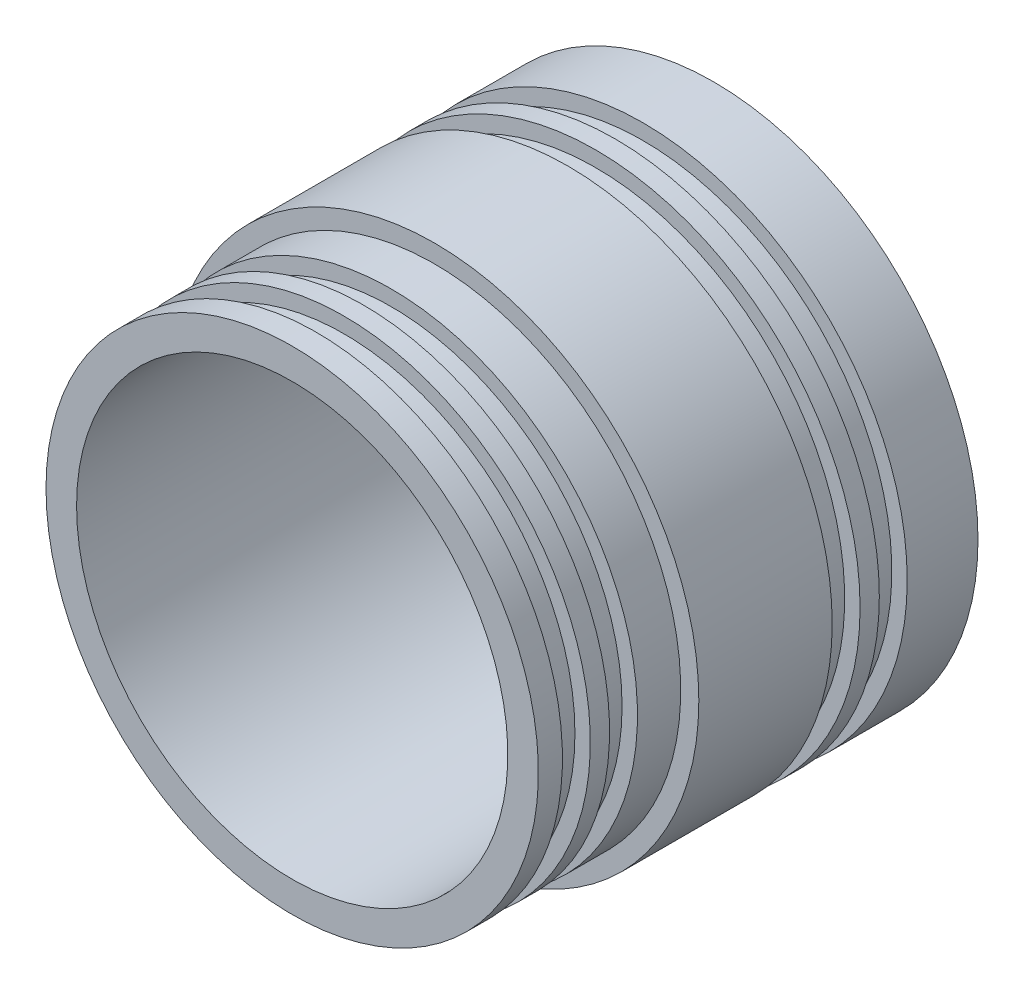
ISO-10303-21;
HEADER;
FILE_DESCRIPTION(('STEP AP214'),'2;1');
FILE_NAME('part.step','',(''),(''),'','','');
FILE_SCHEMA(('AUTOMOTIVE_DESIGN { 1 0 10303 214 1 1 1 1 }'));
ENDSEC;
DATA;
#1=APPLICATION_CONTEXT('core data for automotive mechanical design processes');
#2=APPLICATION_PROTOCOL_DEFINITION('international standard','automotive_design',2000,#1);
#3=PRODUCT_CONTEXT('',#1,'mechanical');
#4=PRODUCT('Part','Part','',(#3));
#5=PRODUCT_RELATED_PRODUCT_CATEGORY('part','',(#4));
#6=PRODUCT_DEFINITION_FORMATION('','',#4);
#7=PRODUCT_DEFINITION_CONTEXT('part definition',#1,'design');
#8=PRODUCT_DEFINITION('design','',#6,#7);
#9=PRODUCT_DEFINITION_SHAPE('','',#8);
#10=(LENGTH_UNIT() NAMED_UNIT(*) SI_UNIT(.MILLI.,.METRE.));
#11=(NAMED_UNIT(*) PLANE_ANGLE_UNIT() SI_UNIT($,.RADIAN.));
#12=(NAMED_UNIT(*) SI_UNIT($,.STERADIAN.) SOLID_ANGLE_UNIT());
#13=UNCERTAINTY_MEASURE_WITH_UNIT(LENGTH_MEASURE(1.E-05),#10,'distance_accuracy_value','');
#14=(GEOMETRIC_REPRESENTATION_CONTEXT(3) GLOBAL_UNCERTAINTY_ASSIGNED_CONTEXT((#13)) GLOBAL_UNIT_ASSIGNED_CONTEXT((#10,
#11,#12)) REPRESENTATION_CONTEXT('',''));
#15=CARTESIAN_POINT('',(0.,0.,0.));
#16=DIRECTION('',(0.,0.,1.));
#17=DIRECTION('',(1.,0.,0.));
#18=AXIS2_PLACEMENT_3D('',#15,#16,#17);
#19=CARTESIAN_POINT('',(0.,0.,0.));
#20=DIRECTION('',(0.,0.,-1.));
#21=DIRECTION('',(-1.,0.,0.));
#22=AXIS2_PLACEMENT_3D('',#19,#20,#21);
#23=CYLINDRICAL_SURFACE('',#22,28.4734);
#24=CARTESIAN_POINT('',(0.,0.,0.));
#25=DIRECTION('',(0.,0.,-1.));
#26=DIRECTION('',(-1.,0.,0.));
#27=AXIS2_PLACEMENT_3D('',#24,#25,#26);
#28=CIRCLE('',#27,28.4734);
#29=CARTESIAN_POINT('',(-28.4734,0.,0.));
#30=VERTEX_POINT('',#29);
#31=EDGE_CURVE('E10',#30,#30,#28,.T.);
#32=ORIENTED_EDGE('',*,*,#31,.T.);
#33=EDGE_LOOP('',(#32));
#34=FACE_BOUND('',#33,.T.);
#35=CARTESIAN_POINT('',(0.,0.,49.48936));
#36=DIRECTION('',(0.,0.,-1.));
#37=DIRECTION('',(-1.,0.,0.));
#38=AXIS2_PLACEMENT_3D('',#35,#36,#37);
#39=CIRCLE('',#38,28.4734);
#40=CARTESIAN_POINT('',(-28.4734,0.,49.48936));
#41=VERTEX_POINT('',#40);
#42=EDGE_CURVE('E144',#41,#41,#39,.T.);
#43=ORIENTED_EDGE('',*,*,#42,.F.);
#44=EDGE_LOOP('',(#43));
#45=FACE_BOUND('',#44,.T.);
#46=ADVANCED_FACE('F41',(#34,#45),#23,.F.);
#47=CARTESIAN_POINT('',(0.,28.4734,0.));
#48=DIRECTION('',(0.,0.,-1.));
#49=DIRECTION('',(-1.,0.,0.));
#50=AXIS2_PLACEMENT_3D('',#47,#48,#49);
#51=PLANE('',#50);
#52=CARTESIAN_POINT('',(0.,0.,0.));
#53=DIRECTION('',(0.,0.,-1.));
#54=DIRECTION('',(-1.,0.,0.));
#55=AXIS2_PLACEMENT_3D('',#52,#53,#54);
#56=CIRCLE('',#55,32.8676);
#57=CARTESIAN_POINT('',(-32.8676,0.,0.));
#58=VERTEX_POINT('',#57);
#59=EDGE_CURVE('E48',#58,#58,#56,.T.);
#60=ORIENTED_EDGE('',*,*,#59,.T.);
#61=EDGE_LOOP('',(#60));
#62=FACE_BOUND('',#61,.T.);
#63=ORIENTED_EDGE('',*,*,#31,.F.);
#64=EDGE_LOOP('',(#63));
#65=FACE_BOUND('',#64,.T.);
#66=ADVANCED_FACE('F155',(#62,#65),#51,.T.);
#67=CARTESIAN_POINT('',(0.,0.,0.));
#68=DIRECTION('',(0.,0.,-1.));
#69=DIRECTION('',(-1.,0.,0.));
#70=AXIS2_PLACEMENT_3D('',#67,#68,#69);
#71=CYLINDRICAL_SURFACE('',#70,32.8676);
#72=CARTESIAN_POINT('',(0.,0.,-6.1722));
#73=DIRECTION('',(0.,0.,-1.));
#74=DIRECTION('',(-1.,0.,0.));
#75=AXIS2_PLACEMENT_3D('',#72,#73,#74);
#76=CIRCLE('',#75,32.8676);
#77=CARTESIAN_POINT('',(-32.8676,0.,-6.1722));
#78=VERTEX_POINT('',#77);
#79=EDGE_CURVE('E55',#78,#78,#76,.T.);
#80=ORIENTED_EDGE('',*,*,#79,.T.);
#81=EDGE_LOOP('',(#80));
#82=FACE_BOUND('',#81,.T.);
#83=ORIENTED_EDGE('',*,*,#59,.F.);
#84=EDGE_LOOP('',(#83));
#85=FACE_BOUND('',#84,.T.);
#86=ADVANCED_FACE('F159',(#82,#85),#71,.F.);
#87=CARTESIAN_POINT('',(0.,34.8996,-6.1722));
#88=DIRECTION('',(0.,0.,-1.));
#89=DIRECTION('',(-1.,0.,0.));
#90=AXIS2_PLACEMENT_3D('',#87,#88,#89);
#91=PLANE('',#90);
#92=CARTESIAN_POINT('',(0.,0.,-6.1722));
#93=DIRECTION('',(0.,0.,-1.));
#94=DIRECTION('',(-1.,0.,0.));
#95=AXIS2_PLACEMENT_3D('',#92,#93,#94);
#96=CIRCLE('',#95,34.8996);
#97=CARTESIAN_POINT('',(-34.8996,0.,-6.1722));
#98=VERTEX_POINT('',#97);
#99=EDGE_CURVE('E62',#98,#98,#96,.T.);
#100=ORIENTED_EDGE('',*,*,#99,.T.);
#101=EDGE_LOOP('',(#100));
#102=FACE_BOUND('',#101,.T.);
#103=ORIENTED_EDGE('',*,*,#79,.F.);
#104=EDGE_LOOP('',(#103));
#105=FACE_BOUND('',#104,.T.);
#106=ADVANCED_FACE('F163',(#102,#105),#91,.T.);
#107=CARTESIAN_POINT('',(0.,0.,0.));
#108=DIRECTION('',(0.,0.,-1.));
#109=DIRECTION('',(-1.,0.,0.));
#110=AXIS2_PLACEMENT_3D('',#107,#108,#109);
#111=CYLINDRICAL_SURFACE('',#110,34.8996);
#112=CARTESIAN_POINT('',(0.,0.,3.175));
#113=DIRECTION('',(0.,0.,-1.));
#114=DIRECTION('',(-1.,0.,0.));
#115=AXIS2_PLACEMENT_3D('',#112,#113,#114);
#116=CIRCLE('',#115,34.8996);
#117=CARTESIAN_POINT('',(-34.8996,0.,3.175));
#118=VERTEX_POINT('',#117);
#119=EDGE_CURVE('E68',#118,#118,#116,.T.);
#120=ORIENTED_EDGE('',*,*,#119,.T.);
#121=EDGE_LOOP('',(#120));
#122=FACE_BOUND('',#121,.T.);
#123=ORIENTED_EDGE('',*,*,#99,.F.);
#124=EDGE_LOOP('',(#123));
#125=FACE_BOUND('',#124,.T.);
#126=ADVANCED_FACE('F170',(#122,#125),#111,.T.);
#127=CARTESIAN_POINT('',(0.,32.8676,3.175));
#128=DIRECTION('',(0.,0.,1.));
#129=DIRECTION('',(1.,0.,0.));
#130=AXIS2_PLACEMENT_3D('',#127,#128,#129);
#131=PLANE('',#130);
#132=CARTESIAN_POINT('',(0.,0.,3.175));
#133=DIRECTION('',(0.,0.,-1.));
#134=DIRECTION('',(-1.,0.,0.));
#135=AXIS2_PLACEMENT_3D('',#132,#133,#134);
#136=CIRCLE('',#135,32.8676);
#137=CARTESIAN_POINT('',(-32.8676,0.,3.175));
#138=VERTEX_POINT('',#137);
#139=EDGE_CURVE('E72',#138,#138,#136,.T.);
#140=ORIENTED_EDGE('',*,*,#139,.T.);
#141=EDGE_LOOP('',(#140));
#142=FACE_BOUND('',#141,.T.);
#143=ORIENTED_EDGE('',*,*,#119,.F.);
#144=EDGE_LOOP('',(#143));
#145=FACE_BOUND('',#144,.T.);
#146=ADVANCED_FACE('F174',(#142,#145),#131,.T.);
#147=CARTESIAN_POINT('',(0.,0.,0.));
#148=DIRECTION('',(0.,0.,-1.));
#149=DIRECTION('',(-1.,0.,0.));
#150=AXIS2_PLACEMENT_3D('',#147,#148,#149);
#151=CYLINDRICAL_SURFACE('',#150,32.8676);
#152=CARTESIAN_POINT('',(0.,0.,6.85799999999999));
#153=DIRECTION('',(0.,0.,-1.));
#154=DIRECTION('',(-1.,0.,0.));
#155=AXIS2_PLACEMENT_3D('',#152,#153,#154);
#156=CIRCLE('',#155,32.8676);
#157=CARTESIAN_POINT('',(-32.8676,0.,6.85799999999999));
#158=VERTEX_POINT('',#157);
#159=EDGE_CURVE('E76',#158,#158,#156,.T.);
#160=ORIENTED_EDGE('',*,*,#159,.T.);
#161=EDGE_LOOP('',(#160));
#162=FACE_BOUND('',#161,.T.);
#163=ORIENTED_EDGE('',*,*,#139,.F.);
#164=EDGE_LOOP('',(#163));
#165=FACE_BOUND('',#164,.T.);
#166=ADVANCED_FACE('F178',(#162,#165),#151,.T.);
#167=CARTESIAN_POINT('',(0.,34.8996,6.85799999999999));
#168=DIRECTION('',(0.,0.,-1.));
#169=DIRECTION('',(-1.,0.,0.));
#170=AXIS2_PLACEMENT_3D('',#167,#168,#169);
#171=PLANE('',#170);
#172=CARTESIAN_POINT('',(0.,0.,6.85799999999999));
#173=DIRECTION('',(0.,0.,-1.));
#174=DIRECTION('',(-1.,0.,0.));
#175=AXIS2_PLACEMENT_3D('',#172,#173,#174);
#176=CIRCLE('',#175,34.8996);
#177=CARTESIAN_POINT('',(-34.8996,0.,6.85799999999999));
#178=VERTEX_POINT('',#177);
#179=EDGE_CURVE('E80',#178,#178,#176,.T.);
#180=ORIENTED_EDGE('',*,*,#179,.T.);
#181=EDGE_LOOP('',(#180));
#182=FACE_BOUND('',#181,.T.);
#183=ORIENTED_EDGE('',*,*,#159,.F.);
#184=EDGE_LOOP('',(#183));
#185=FACE_BOUND('',#184,.T.);
#186=ADVANCED_FACE('F182',(#182,#185),#171,.T.);
#187=CARTESIAN_POINT('',(0.,0.,0.));
#188=DIRECTION('',(0.,0.,-1.));
#189=DIRECTION('',(-1.,0.,0.));
#190=AXIS2_PLACEMENT_3D('',#187,#188,#189);
#191=CYLINDRICAL_SURFACE('',#190,34.8996);
#192=CARTESIAN_POINT('',(0.,0.,9.39799999999999));
#193=DIRECTION('',(0.,0.,-1.));
#194=DIRECTION('',(-1.,0.,0.));
#195=AXIS2_PLACEMENT_3D('',#192,#193,#194);
#196=CIRCLE('',#195,34.8996);
#197=CARTESIAN_POINT('',(-34.8996,0.,9.39799999999999));
#198=VERTEX_POINT('',#197);
#199=EDGE_CURVE('E84',#198,#198,#196,.T.);
#200=ORIENTED_EDGE('',*,*,#199,.T.);
#201=EDGE_LOOP('',(#200));
#202=FACE_BOUND('',#201,.T.);
#203=ORIENTED_EDGE('',*,*,#179,.F.);
#204=EDGE_LOOP('',(#203));
#205=FACE_BOUND('',#204,.T.);
#206=ADVANCED_FACE('F186',(#202,#205),#191,.T.);
#207=CARTESIAN_POINT('',(0.,32.8676,9.39799999999999));
#208=DIRECTION('',(0.,0.,1.));
#209=DIRECTION('',(1.,0.,0.));
#210=AXIS2_PLACEMENT_3D('',#207,#208,#209);
#211=PLANE('',#210);
#212=CARTESIAN_POINT('',(0.,0.,9.39799999999999));
#213=DIRECTION('',(0.,0.,-1.));
#214=DIRECTION('',(-1.,0.,0.));
#215=AXIS2_PLACEMENT_3D('',#212,#213,#214);
#216=CIRCLE('',#215,32.8676);
#217=CARTESIAN_POINT('',(-32.8676,0.,9.39799999999999));
#218=VERTEX_POINT('',#217);
#219=EDGE_CURVE('E88',#218,#218,#216,.T.);
#220=ORIENTED_EDGE('',*,*,#219,.T.);
#221=EDGE_LOOP('',(#220));
#222=FACE_BOUND('',#221,.T.);
#223=ORIENTED_EDGE('',*,*,#199,.F.);
#224=EDGE_LOOP('',(#223));
#225=FACE_BOUND('',#224,.T.);
#226=ADVANCED_FACE('F190',(#222,#225),#211,.T.);
#227=CARTESIAN_POINT('',(0.,0.,0.));
#228=DIRECTION('',(0.,0.,-1.));
#229=DIRECTION('',(-1.,0.,0.));
#230=AXIS2_PLACEMENT_3D('',#227,#228,#229);
#231=CYLINDRICAL_SURFACE('',#230,32.8676);
#232=CARTESIAN_POINT('',(0.,0.,13.081));
#233=DIRECTION('',(0.,0.,-1.));
#234=DIRECTION('',(-1.,0.,0.));
#235=AXIS2_PLACEMENT_3D('',#232,#233,#234);
#236=CIRCLE('',#235,32.8676);
#237=CARTESIAN_POINT('',(-32.8676,0.,13.081));
#238=VERTEX_POINT('',#237);
#239=EDGE_CURVE('E92',#238,#238,#236,.T.);
#240=ORIENTED_EDGE('',*,*,#239,.T.);
#241=EDGE_LOOP('',(#240));
#242=FACE_BOUND('',#241,.T.);
#243=ORIENTED_EDGE('',*,*,#219,.F.);
#244=EDGE_LOOP('',(#243));
#245=FACE_BOUND('',#244,.T.);
#246=ADVANCED_FACE('F194',(#242,#245),#231,.T.);
#247=CARTESIAN_POINT('',(0.,34.8996,13.081));
#248=DIRECTION('',(0.,0.,-1.));
#249=DIRECTION('',(-1.,0.,0.));
#250=AXIS2_PLACEMENT_3D('',#247,#248,#249);
#251=PLANE('',#250);
#252=CARTESIAN_POINT('',(0.,0.,13.081));
#253=DIRECTION('',(0.,0.,-1.));
#254=DIRECTION('',(-1.,0.,0.));
#255=AXIS2_PLACEMENT_3D('',#252,#253,#254);
#256=CIRCLE('',#255,34.8996);
#257=CARTESIAN_POINT('',(-34.8996,0.,13.081));
#258=VERTEX_POINT('',#257);
#259=EDGE_CURVE('E96',#258,#258,#256,.T.);
#260=ORIENTED_EDGE('',*,*,#259,.T.);
#261=EDGE_LOOP('',(#260));
#262=FACE_BOUND('',#261,.T.);
#263=ORIENTED_EDGE('',*,*,#239,.F.);
#264=EDGE_LOOP('',(#263));
#265=FACE_BOUND('',#264,.T.);
#266=ADVANCED_FACE('F198',(#262,#265),#251,.T.);
#267=CARTESIAN_POINT('',(0.,0.,0.));
#268=DIRECTION('',(0.,0.,-1.));
#269=DIRECTION('',(-1.,0.,0.));
#270=AXIS2_PLACEMENT_3D('',#267,#268,#269);
#271=CYLINDRICAL_SURFACE('',#270,34.8996);
#272=CARTESIAN_POINT('',(0.,0.,30.69336));
#273=DIRECTION('',(0.,0.,-1.));
#274=DIRECTION('',(-1.,0.,0.));
#275=AXIS2_PLACEMENT_3D('',#272,#273,#274);
#276=CIRCLE('',#275,34.8996);
#277=CARTESIAN_POINT('',(-34.8996,0.,30.69336));
#278=VERTEX_POINT('',#277);
#279=EDGE_CURVE('E100',#278,#278,#276,.T.);
#280=ORIENTED_EDGE('',*,*,#279,.T.);
#281=EDGE_LOOP('',(#280));
#282=FACE_BOUND('',#281,.T.);
#283=ORIENTED_EDGE('',*,*,#259,.F.);
#284=EDGE_LOOP('',(#283));
#285=FACE_BOUND('',#284,.T.);
#286=ADVANCED_FACE('F202',(#282,#285),#271,.T.);
#287=CARTESIAN_POINT('',(0.,32.512,30.69336));
#288=DIRECTION('',(0.,0.,1.));
#289=DIRECTION('',(1.,0.,0.));
#290=AXIS2_PLACEMENT_3D('',#287,#288,#289);
#291=PLANE('',#290);
#292=CARTESIAN_POINT('',(0.,0.,30.69336));
#293=DIRECTION('',(0.,0.,-1.));
#294=DIRECTION('',(-1.,0.,0.));
#295=AXIS2_PLACEMENT_3D('',#292,#293,#294);
#296=CIRCLE('',#295,32.512);
#297=CARTESIAN_POINT('',(-32.512,0.,30.69336));
#298=VERTEX_POINT('',#297);
#299=EDGE_CURVE('E104',#298,#298,#296,.T.);
#300=ORIENTED_EDGE('',*,*,#299,.T.);
#301=EDGE_LOOP('',(#300));
#302=FACE_BOUND('',#301,.T.);
#303=ORIENTED_EDGE('',*,*,#279,.F.);
#304=EDGE_LOOP('',(#303));
#305=FACE_BOUND('',#304,.T.);
#306=ADVANCED_FACE('F206',(#302,#305),#291,.T.);
#307=CARTESIAN_POINT('',(0.,0.,0.));
#308=DIRECTION('',(0.,0.,-1.));
#309=DIRECTION('',(-1.,0.,0.));
#310=AXIS2_PLACEMENT_3D('',#307,#308,#309);
#311=CYLINDRICAL_SURFACE('',#310,32.512);
#312=CARTESIAN_POINT('',(0.,0.,36.40836));
#313=DIRECTION('',(0.,0.,-1.));
#314=DIRECTION('',(-1.,0.,0.));
#315=AXIS2_PLACEMENT_3D('',#312,#313,#314);
#316=CIRCLE('',#315,32.512);
#317=CARTESIAN_POINT('',(-32.512,0.,36.40836));
#318=VERTEX_POINT('',#317);
#319=EDGE_CURVE('E108',#318,#318,#316,.T.);
#320=ORIENTED_EDGE('',*,*,#319,.T.);
#321=EDGE_LOOP('',(#320));
#322=FACE_BOUND('',#321,.T.);
#323=ORIENTED_EDGE('',*,*,#299,.F.);
#324=EDGE_LOOP('',(#323));
#325=FACE_BOUND('',#324,.T.);
#326=ADVANCED_FACE('F210',(#322,#325),#311,.T.);
#327=CARTESIAN_POINT('',(0.,30.48,36.40836));
#328=DIRECTION('',(0.,0.,1.));
#329=DIRECTION('',(1.,0.,0.));
#330=AXIS2_PLACEMENT_3D('',#327,#328,#329);
#331=PLANE('',#330);
#332=CARTESIAN_POINT('',(0.,0.,36.40836));
#333=DIRECTION('',(0.,0.,-1.));
#334=DIRECTION('',(-1.,0.,0.));
#335=AXIS2_PLACEMENT_3D('',#332,#333,#334);
#336=CIRCLE('',#335,30.48);
#337=CARTESIAN_POINT('',(-30.48,0.,36.40836));
#338=VERTEX_POINT('',#337);
#339=EDGE_CURVE('E112',#338,#338,#336,.T.);
#340=ORIENTED_EDGE('',*,*,#339,.T.);
#341=EDGE_LOOP('',(#340));
#342=FACE_BOUND('',#341,.T.);
#343=ORIENTED_EDGE('',*,*,#319,.F.);
#344=EDGE_LOOP('',(#343));
#345=FACE_BOUND('',#344,.T.);
#346=ADVANCED_FACE('F214',(#342,#345),#331,.T.);
#347=CARTESIAN_POINT('',(0.,0.,0.));
#348=DIRECTION('',(0.,0.,-1.));
#349=DIRECTION('',(-1.,0.,0.));
#350=AXIS2_PLACEMENT_3D('',#347,#348,#349);
#351=CYLINDRICAL_SURFACE('',#350,30.48);
#352=CARTESIAN_POINT('',(0.,0.,40.09136));
#353=DIRECTION('',(0.,0.,-1.));
#354=DIRECTION('',(-1.,0.,0.));
#355=AXIS2_PLACEMENT_3D('',#352,#353,#354);
#356=CIRCLE('',#355,30.48);
#357=CARTESIAN_POINT('',(-30.48,0.,40.09136));
#358=VERTEX_POINT('',#357);
#359=EDGE_CURVE('E116',#358,#358,#356,.T.);
#360=ORIENTED_EDGE('',*,*,#359,.T.);
#361=EDGE_LOOP('',(#360));
#362=FACE_BOUND('',#361,.T.);
#363=ORIENTED_EDGE('',*,*,#339,.F.);
#364=EDGE_LOOP('',(#363));
#365=FACE_BOUND('',#364,.T.);
#366=ADVANCED_FACE('F218',(#362,#365),#351,.T.);
#367=CARTESIAN_POINT('',(0.,32.512,40.09136));
#368=DIRECTION('',(0.,0.,-1.));
#369=DIRECTION('',(-1.,0.,0.));
#370=AXIS2_PLACEMENT_3D('',#367,#368,#369);
#371=PLANE('',#370);
#372=CARTESIAN_POINT('',(0.,0.,40.09136));
#373=DIRECTION('',(0.,0.,-1.));
#374=DIRECTION('',(-1.,0.,0.));
#375=AXIS2_PLACEMENT_3D('',#372,#373,#374);
#376=CIRCLE('',#375,32.512);
#377=CARTESIAN_POINT('',(-32.512,0.,40.09136));
#378=VERTEX_POINT('',#377);
#379=EDGE_CURVE('E120',#378,#378,#376,.T.);
#380=ORIENTED_EDGE('',*,*,#379,.T.);
#381=EDGE_LOOP('',(#380));
#382=FACE_BOUND('',#381,.T.);
#383=ORIENTED_EDGE('',*,*,#359,.F.);
#384=EDGE_LOOP('',(#383));
#385=FACE_BOUND('',#384,.T.);
#386=ADVANCED_FACE('F222',(#382,#385),#371,.T.);
#387=CARTESIAN_POINT('',(0.,0.,0.));
#388=DIRECTION('',(0.,0.,-1.));
#389=DIRECTION('',(-1.,0.,0.));
#390=AXIS2_PLACEMENT_3D('',#387,#388,#389);
#391=CYLINDRICAL_SURFACE('',#390,32.512);
#392=CARTESIAN_POINT('',(0.,0.,42.63136));
#393=DIRECTION('',(0.,0.,-1.));
#394=DIRECTION('',(-1.,0.,0.));
#395=AXIS2_PLACEMENT_3D('',#392,#393,#394);
#396=CIRCLE('',#395,32.512);
#397=CARTESIAN_POINT('',(-32.512,0.,42.63136));
#398=VERTEX_POINT('',#397);
#399=EDGE_CURVE('E124',#398,#398,#396,.T.);
#400=ORIENTED_EDGE('',*,*,#399,.T.);
#401=EDGE_LOOP('',(#400));
#402=FACE_BOUND('',#401,.T.);
#403=ORIENTED_EDGE('',*,*,#379,.F.);
#404=EDGE_LOOP('',(#403));
#405=FACE_BOUND('',#404,.T.);
#406=ADVANCED_FACE('F226',(#402,#405),#391,.T.);
#407=CARTESIAN_POINT('',(0.,30.48,42.63136));
#408=DIRECTION('',(0.,0.,1.));
#409=DIRECTION('',(1.,0.,0.));
#410=AXIS2_PLACEMENT_3D('',#407,#408,#409);
#411=PLANE('',#410);
#412=CARTESIAN_POINT('',(0.,0.,42.63136));
#413=DIRECTION('',(0.,0.,-1.));
#414=DIRECTION('',(-1.,0.,0.));
#415=AXIS2_PLACEMENT_3D('',#412,#413,#414);
#416=CIRCLE('',#415,30.48);
#417=CARTESIAN_POINT('',(-30.48,0.,42.63136));
#418=VERTEX_POINT('',#417);
#419=EDGE_CURVE('E128',#418,#418,#416,.T.);
#420=ORIENTED_EDGE('',*,*,#419,.T.);
#421=EDGE_LOOP('',(#420));
#422=FACE_BOUND('',#421,.T.);
#423=ORIENTED_EDGE('',*,*,#399,.F.);
#424=EDGE_LOOP('',(#423));
#425=FACE_BOUND('',#424,.T.);
#426=ADVANCED_FACE('F230',(#422,#425),#411,.T.);
#427=CARTESIAN_POINT('',(0.,0.,0.));
#428=DIRECTION('',(0.,0.,-1.));
#429=DIRECTION('',(-1.,0.,0.));
#430=AXIS2_PLACEMENT_3D('',#427,#428,#429);
#431=CYLINDRICAL_SURFACE('',#430,30.48);
#432=CARTESIAN_POINT('',(0.,0.,46.31436));
#433=DIRECTION('',(0.,0.,-1.));
#434=DIRECTION('',(-1.,0.,0.));
#435=AXIS2_PLACEMENT_3D('',#432,#433,#434);
#436=CIRCLE('',#435,30.48);
#437=CARTESIAN_POINT('',(-30.48,0.,46.31436));
#438=VERTEX_POINT('',#437);
#439=EDGE_CURVE('E132',#438,#438,#436,.T.);
#440=ORIENTED_EDGE('',*,*,#439,.T.);
#441=EDGE_LOOP('',(#440));
#442=FACE_BOUND('',#441,.T.);
#443=ORIENTED_EDGE('',*,*,#419,.F.);
#444=EDGE_LOOP('',(#443));
#445=FACE_BOUND('',#444,.T.);
#446=ADVANCED_FACE('F234',(#442,#445),#431,.T.);
#447=CARTESIAN_POINT('',(0.,32.512,46.31436));
#448=DIRECTION('',(0.,0.,-1.));
#449=DIRECTION('',(-1.,0.,0.));
#450=AXIS2_PLACEMENT_3D('',#447,#448,#449);
#451=PLANE('',#450);
#452=CARTESIAN_POINT('',(0.,0.,46.31436));
#453=DIRECTION('',(0.,0.,-1.));
#454=DIRECTION('',(-1.,0.,0.));
#455=AXIS2_PLACEMENT_3D('',#452,#453,#454);
#456=CIRCLE('',#455,32.512);
#457=CARTESIAN_POINT('',(-32.512,0.,46.31436));
#458=VERTEX_POINT('',#457);
#459=EDGE_CURVE('E136',#458,#458,#456,.T.);
#460=ORIENTED_EDGE('',*,*,#459,.T.);
#461=EDGE_LOOP('',(#460));
#462=FACE_BOUND('',#461,.T.);
#463=ORIENTED_EDGE('',*,*,#439,.F.);
#464=EDGE_LOOP('',(#463));
#465=FACE_BOUND('',#464,.T.);
#466=ADVANCED_FACE('F238',(#462,#465),#451,.T.);
#467=CARTESIAN_POINT('',(0.,0.,0.));
#468=DIRECTION('',(0.,0.,-1.));
#469=DIRECTION('',(-1.,0.,0.));
#470=AXIS2_PLACEMENT_3D('',#467,#468,#469);
#471=CYLINDRICAL_SURFACE('',#470,32.512);
#472=CARTESIAN_POINT('',(0.,0.,49.48936));
#473=DIRECTION('',(0.,0.,-1.));
#474=DIRECTION('',(-1.,0.,0.));
#475=AXIS2_PLACEMENT_3D('',#472,#473,#474);
#476=CIRCLE('',#475,32.512);
#477=CARTESIAN_POINT('',(-32.512,0.,49.48936));
#478=VERTEX_POINT('',#477);
#479=EDGE_CURVE('E140',#478,#478,#476,.T.);
#480=ORIENTED_EDGE('',*,*,#479,.T.);
#481=EDGE_LOOP('',(#480));
#482=FACE_BOUND('',#481,.T.);
#483=ORIENTED_EDGE('',*,*,#459,.F.);
#484=EDGE_LOOP('',(#483));
#485=FACE_BOUND('',#484,.T.);
#486=ADVANCED_FACE('F242',(#482,#485),#471,.T.);
#487=CARTESIAN_POINT('',(0.,32.512,49.48936));
#488=DIRECTION('',(0.,0.,1.));
#489=DIRECTION('',(1.,0.,0.));
#490=AXIS2_PLACEMENT_3D('',#487,#488,#489);
#491=PLANE('',#490);
#492=ORIENTED_EDGE('',*,*,#42,.T.);
#493=EDGE_LOOP('',(#492));
#494=FACE_BOUND('',#493,.T.);
#495=ORIENTED_EDGE('',*,*,#479,.F.);
#496=EDGE_LOOP('',(#495));
#497=FACE_BOUND('',#496,.T.);
#498=ADVANCED_FACE('F151',(#494,#497),#491,.T.);
#499=CLOSED_SHELL('',(#46,#66,#86,#106,#126,#146,#166,#186,#206,#226,#246,#266,#286,#306,#326,
#346,#366,#386,#406,#426,#446,#466,#486,#498));
#500=MANIFOLD_SOLID_BREP('B2',#499);
#501=ADVANCED_BREP_SHAPE_REPRESENTATION('',(#18,#500),#14);
#502=SHAPE_DEFINITION_REPRESENTATION(#9,#501);
ENDSEC;
END-ISO-10303-21;
